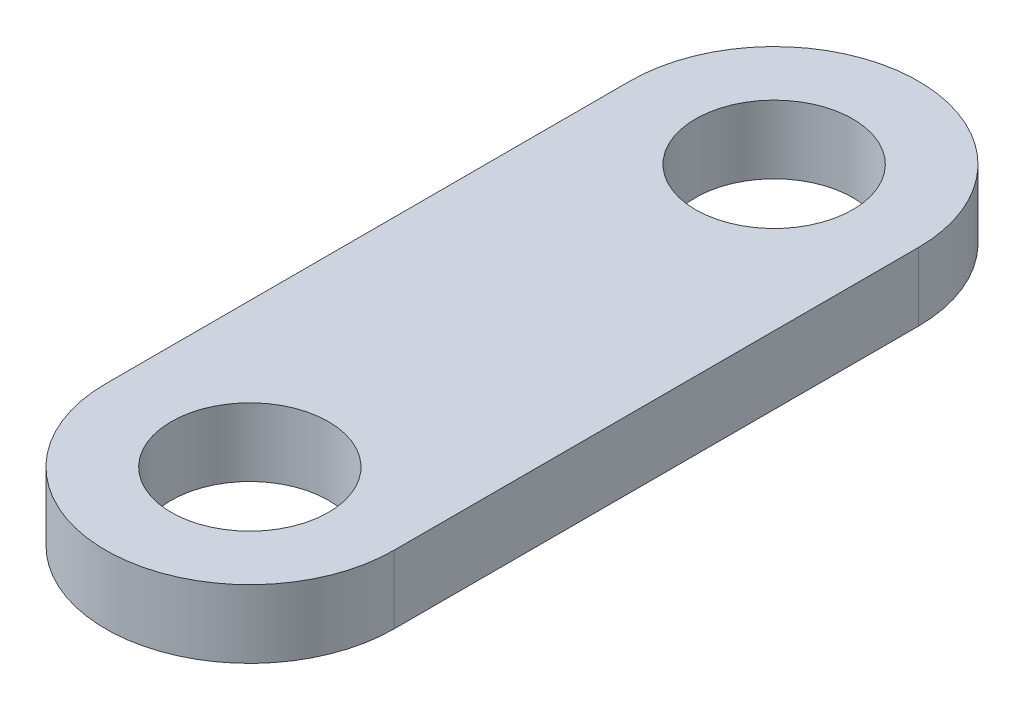
ISO-10303-21;
HEADER;
FILE_DESCRIPTION(('STEP AP214'),'2;1');
FILE_NAME('part.step','',(''),(''),'','','');
FILE_SCHEMA(('AUTOMOTIVE_DESIGN { 1 0 10303 214 1 1 1 1 }'));
ENDSEC;
DATA;
#1=APPLICATION_CONTEXT('core data for automotive mechanical design processes');
#2=APPLICATION_PROTOCOL_DEFINITION('international standard','automotive_design',2000,#1);
#3=PRODUCT_CONTEXT('',#1,'mechanical');
#4=PRODUCT('Part','Part','',(#3));
#5=PRODUCT_RELATED_PRODUCT_CATEGORY('part','',(#4));
#6=PRODUCT_DEFINITION_FORMATION('','',#4);
#7=PRODUCT_DEFINITION_CONTEXT('part definition',#1,'design');
#8=PRODUCT_DEFINITION('design','',#6,#7);
#9=PRODUCT_DEFINITION_SHAPE('','',#8);
#10=(LENGTH_UNIT() NAMED_UNIT(*) SI_UNIT(.MILLI.,.METRE.));
#11=(NAMED_UNIT(*) PLANE_ANGLE_UNIT() SI_UNIT($,.RADIAN.));
#12=(NAMED_UNIT(*) SI_UNIT($,.STERADIAN.) SOLID_ANGLE_UNIT());
#13=UNCERTAINTY_MEASURE_WITH_UNIT(LENGTH_MEASURE(1.E-05),#10,'distance_accuracy_value','');
#14=(GEOMETRIC_REPRESENTATION_CONTEXT(3) GLOBAL_UNCERTAINTY_ASSIGNED_CONTEXT((#13)) GLOBAL_UNIT_ASSIGNED_CONTEXT((#10,
#11,#12)) REPRESENTATION_CONTEXT('',''));
#15=CARTESIAN_POINT('',(0.,0.,0.));
#16=DIRECTION('',(0.,0.,1.));
#17=DIRECTION('',(1.,0.,0.));
#18=AXIS2_PLACEMENT_3D('',#15,#16,#17);
#19=CARTESIAN_POINT('',(0.,2.6,-10.));
#20=DIRECTION('',(0.,1.,0.));
#21=DIRECTION('',(0.,0.,1.));
#22=AXIS2_PLACEMENT_3D('',#19,#20,#21);
#23=PLANE('',#22);
#24=CARTESIAN_POINT('',(0.,2.6,-10.));
#25=DIRECTION('',(0.,1.,0.));
#26=DIRECTION('',(0.,0.,1.));
#27=AXIS2_PLACEMENT_3D('',#24,#25,#26);
#28=CIRCLE('',#27,3.);
#29=CARTESIAN_POINT('',(0.,2.6,-7.));
#30=VERTEX_POINT('',#29);
#31=EDGE_CURVE('E102',#30,#30,#28,.T.);
#32=ORIENTED_EDGE('',*,*,#31,.F.);
#33=EDGE_LOOP('',(#32));
#34=FACE_BOUND('',#33,.T.);
#35=CARTESIAN_POINT('',(0.,2.6,-10.));
#36=DIRECTION('',(0.,1.,0.));
#37=DIRECTION('',(0.,0.,1.));
#38=AXIS2_PLACEMENT_3D('',#35,#36,#37);
#39=CIRCLE('',#38,5.49999999999999);
#40=CARTESIAN_POINT('',(5.49999999999999,2.6,-10.));
#41=VERTEX_POINT('',#40);
#42=CARTESIAN_POINT('',(-5.49999999999999,2.6,-10.));
#43=VERTEX_POINT('',#42);
#44=EDGE_CURVE('E87',#41,#43,#39,.T.);
#45=ORIENTED_EDGE('',*,*,#44,.T.);
#46=DIRECTION('',(0.,0.,1.));
#47=VECTOR('',#46,1.);
#48=CARTESIAN_POINT('',(-5.49999999999999,2.6,-10.));
#49=LINE('',#48,#47);
#50=CARTESIAN_POINT('',(-5.49999999999999,2.6,10.));
#51=VERTEX_POINT('',#50);
#52=EDGE_CURVE('E82',#43,#51,#49,.T.);
#53=ORIENTED_EDGE('',*,*,#52,.T.);
#54=CARTESIAN_POINT('',(0.,2.6,10.));
#55=DIRECTION('',(0.,1.,0.));
#56=DIRECTION('',(0.,0.,1.));
#57=AXIS2_PLACEMENT_3D('',#54,#55,#56);
#58=CIRCLE('',#57,5.49999999999999);
#59=CARTESIAN_POINT('',(5.49999999999999,2.6,10.));
#60=VERTEX_POINT('',#59);
#61=EDGE_CURVE('E85',#51,#60,#58,.T.);
#62=ORIENTED_EDGE('',*,*,#61,.T.);
#63=DIRECTION('',(0.,0.,-1.));
#64=VECTOR('',#63,1.);
#65=CARTESIAN_POINT('',(5.49999999999999,2.6,-10.));
#66=LINE('',#65,#64);
#67=EDGE_CURVE('E52',#60,#41,#66,.T.);
#68=ORIENTED_EDGE('',*,*,#67,.T.);
#69=EDGE_LOOP('',(#45,#53,#62,#68));
#70=FACE_BOUND('',#69,.T.);
#71=CARTESIAN_POINT('',(0.,2.6,10.));
#72=DIRECTION('',(0.,1.,0.));
#73=DIRECTION('',(0.,0.,-1.));
#74=AXIS2_PLACEMENT_3D('',#71,#72,#73);
#75=CIRCLE('',#74,3.);
#76=CARTESIAN_POINT('',(0.,2.6,7.));
#77=VERTEX_POINT('',#76);
#78=EDGE_CURVE('E117',#77,#77,#75,.T.);
#79=ORIENTED_EDGE('',*,*,#78,.F.);
#80=EDGE_LOOP('',(#79));
#81=FACE_BOUND('',#80,.T.);
#82=ADVANCED_FACE('F35',(#34,#70,#81),#23,.T.);
#83=CARTESIAN_POINT('',(0.,0.,-10.));
#84=DIRECTION('',(0.,1.,0.));
#85=DIRECTION('',(0.,0.,1.));
#86=AXIS2_PLACEMENT_3D('',#83,#84,#85);
#87=PLANE('',#86);
#88=CARTESIAN_POINT('',(0.,0.,-10.));
#89=DIRECTION('',(0.,1.,0.));
#90=DIRECTION('',(0.,0.,1.));
#91=AXIS2_PLACEMENT_3D('',#88,#89,#90);
#92=CIRCLE('',#91,5.49999999999999);
#93=CARTESIAN_POINT('',(5.49999999999999,0.,-10.));
#94=VERTEX_POINT('',#93);
#95=CARTESIAN_POINT('',(-5.49999999999999,0.,-10.));
#96=VERTEX_POINT('',#95);
#97=EDGE_CURVE('E99',#94,#96,#92,.T.);
#98=ORIENTED_EDGE('',*,*,#97,.F.);
#99=DIRECTION('',(0.,0.,-1.));
#100=VECTOR('',#99,1.);
#101=CARTESIAN_POINT('',(5.49999999999999,0.,-10.));
#102=LINE('',#101,#100);
#103=CARTESIAN_POINT('',(5.49999999999999,0.,10.));
#104=VERTEX_POINT('',#103);
#105=EDGE_CURVE('E75',#104,#94,#102,.T.);
#106=ORIENTED_EDGE('',*,*,#105,.F.);
#107=CARTESIAN_POINT('',(0.,0.,10.));
#108=DIRECTION('',(0.,1.,0.));
#109=DIRECTION('',(0.,0.,1.));
#110=AXIS2_PLACEMENT_3D('',#107,#108,#109);
#111=CIRCLE('',#110,5.49999999999999);
#112=CARTESIAN_POINT('',(-5.49999999999999,0.,10.));
#113=VERTEX_POINT('',#112);
#114=EDGE_CURVE('E69',#113,#104,#111,.T.);
#115=ORIENTED_EDGE('',*,*,#114,.F.);
#116=DIRECTION('',(0.,0.,1.));
#117=VECTOR('',#116,1.);
#118=CARTESIAN_POINT('',(-5.49999999999999,0.,-10.));
#119=LINE('',#118,#117);
#120=EDGE_CURVE('E91',#96,#113,#119,.T.);
#121=ORIENTED_EDGE('',*,*,#120,.F.);
#122=EDGE_LOOP('',(#98,#106,#115,#121));
#123=FACE_BOUND('',#122,.T.);
#124=CARTESIAN_POINT('',(0.,0.,-10.));
#125=DIRECTION('',(0.,1.,0.));
#126=DIRECTION('',(0.,0.,1.));
#127=AXIS2_PLACEMENT_3D('',#124,#125,#126);
#128=CIRCLE('',#127,3.);
#129=CARTESIAN_POINT('',(0.,0.,-7.));
#130=VERTEX_POINT('',#129);
#131=EDGE_CURVE('E114',#130,#130,#128,.T.);
#132=ORIENTED_EDGE('',*,*,#131,.T.);
#133=EDGE_LOOP('',(#132));
#134=FACE_BOUND('',#133,.T.);
#135=CARTESIAN_POINT('',(0.,0.,10.));
#136=DIRECTION('',(0.,1.,0.));
#137=DIRECTION('',(0.,0.,-1.));
#138=AXIS2_PLACEMENT_3D('',#135,#136,#137);
#139=CIRCLE('',#138,3.);
#140=CARTESIAN_POINT('',(0.,0.,7.));
#141=VERTEX_POINT('',#140);
#142=EDGE_CURVE('E120',#141,#141,#139,.T.);
#143=ORIENTED_EDGE('',*,*,#142,.T.);
#144=EDGE_LOOP('',(#143));
#145=FACE_BOUND('',#144,.T.);
#146=ADVANCED_FACE('F110',(#123,#134,#145),#87,.F.);
#147=CARTESIAN_POINT('',(0.,2.6,-10.));
#148=DIRECTION('',(0.,-1.,0.));
#149=DIRECTION('',(0.,0.,-1.));
#150=AXIS2_PLACEMENT_3D('',#147,#148,#149);
#151=CYLINDRICAL_SURFACE('',#150,5.49999999999999);
#152=ORIENTED_EDGE('',*,*,#97,.T.);
#153=DIRECTION('',(0.,-1.,0.));
#154=VECTOR('',#153,1.);
#155=CARTESIAN_POINT('',(-5.49999999999999,2.6,-10.));
#156=LINE('',#155,#154);
#157=EDGE_CURVE('E11',#43,#96,#156,.T.);
#158=ORIENTED_EDGE('',*,*,#157,.F.);
#159=ORIENTED_EDGE('',*,*,#44,.F.);
#160=DIRECTION('',(0.,-1.,0.));
#161=VECTOR('',#160,1.);
#162=CARTESIAN_POINT('',(5.49999999999999,2.6,-10.));
#163=LINE('',#162,#161);
#164=EDGE_CURVE('E95',#41,#94,#163,.T.);
#165=ORIENTED_EDGE('',*,*,#164,.T.);
#166=EDGE_LOOP('',(#152,#158,#159,#165));
#167=FACE_BOUND('',#166,.T.);
#168=ADVANCED_FACE('F37',(#167),#151,.T.);
#169=CARTESIAN_POINT('',(-5.49999999999999,2.6,-10.));
#170=DIRECTION('',(1.,0.,0.));
#171=DIRECTION('',(0.,0.,-1.));
#172=AXIS2_PLACEMENT_3D('',#169,#170,#171);
#173=PLANE('',#172);
#174=ORIENTED_EDGE('',*,*,#120,.T.);
#175=DIRECTION('',(0.,-1.,0.));
#176=VECTOR('',#175,1.);
#177=CARTESIAN_POINT('',(-5.49999999999999,2.6,10.));
#178=LINE('',#177,#176);
#179=EDGE_CURVE('E44',#51,#113,#178,.T.);
#180=ORIENTED_EDGE('',*,*,#179,.F.);
#181=ORIENTED_EDGE('',*,*,#52,.F.);
#182=ORIENTED_EDGE('',*,*,#157,.T.);
#183=EDGE_LOOP('',(#174,#180,#181,#182));
#184=FACE_BOUND('',#183,.T.);
#185=ADVANCED_FACE('F90',(#184),#173,.F.);
#186=CARTESIAN_POINT('',(0.,2.6,10.));
#187=DIRECTION('',(0.,-1.,0.));
#188=DIRECTION('',(0.,0.,-1.));
#189=AXIS2_PLACEMENT_3D('',#186,#187,#188);
#190=CYLINDRICAL_SURFACE('',#189,5.49999999999999);
#191=ORIENTED_EDGE('',*,*,#114,.T.);
#192=DIRECTION('',(0.,-1.,0.));
#193=VECTOR('',#192,1.);
#194=CARTESIAN_POINT('',(5.49999999999999,2.6,10.));
#195=LINE('',#194,#193);
#196=EDGE_CURVE('E92',#60,#104,#195,.T.);
#197=ORIENTED_EDGE('',*,*,#196,.F.);
#198=ORIENTED_EDGE('',*,*,#61,.F.);
#199=ORIENTED_EDGE('',*,*,#179,.T.);
#200=EDGE_LOOP('',(#191,#197,#198,#199));
#201=FACE_BOUND('',#200,.T.);
#202=ADVANCED_FACE('F93',(#201),#190,.T.);
#203=CARTESIAN_POINT('',(5.49999999999999,2.6,-10.));
#204=DIRECTION('',(-1.,0.,0.));
#205=DIRECTION('',(0.,0.,1.));
#206=AXIS2_PLACEMENT_3D('',#203,#204,#205);
#207=PLANE('',#206);
#208=ORIENTED_EDGE('',*,*,#105,.T.);
#209=ORIENTED_EDGE('',*,*,#164,.F.);
#210=ORIENTED_EDGE('',*,*,#67,.F.);
#211=ORIENTED_EDGE('',*,*,#196,.T.);
#212=EDGE_LOOP('',(#208,#209,#210,#211));
#213=FACE_BOUND('',#212,.T.);
#214=ADVANCED_FACE('F107',(#213),#207,.F.);
#215=CARTESIAN_POINT('',(0.,2.6,-10.));
#216=DIRECTION('',(0.,-1.,0.));
#217=DIRECTION('',(0.,0.,-1.));
#218=AXIS2_PLACEMENT_3D('',#215,#216,#217);
#219=CYLINDRICAL_SURFACE('',#218,3.);
#220=ORIENTED_EDGE('',*,*,#31,.T.);
#221=EDGE_LOOP('',(#220));
#222=FACE_BOUND('',#221,.T.);
#223=ORIENTED_EDGE('',*,*,#131,.F.);
#224=EDGE_LOOP('',(#223));
#225=FACE_BOUND('',#224,.T.);
#226=ADVANCED_FACE('F137',(#222,#225),#219,.F.);
#227=CARTESIAN_POINT('',(0.,2.6,10.));
#228=DIRECTION('',(0.,-1.,0.));
#229=DIRECTION('',(0.,0.,-1.));
#230=AXIS2_PLACEMENT_3D('',#227,#228,#229);
#231=CYLINDRICAL_SURFACE('',#230,3.);
#232=ORIENTED_EDGE('',*,*,#78,.T.);
#233=EDGE_LOOP('',(#232));
#234=FACE_BOUND('',#233,.T.);
#235=ORIENTED_EDGE('',*,*,#142,.F.);
#236=EDGE_LOOP('',(#235));
#237=FACE_BOUND('',#236,.T.);
#238=ADVANCED_FACE('F126',(#234,#237),#231,.F.);
#239=CLOSED_SHELL('',(#82,#146,#168,#185,#202,#214,#226,#238));
#240=MANIFOLD_SOLID_BREP('B2',#239);
#241=ADVANCED_BREP_SHAPE_REPRESENTATION('',(#18,#240),#14);
#242=SHAPE_DEFINITION_REPRESENTATION(#9,#241);
ENDSEC;
END-ISO-10303-21;
